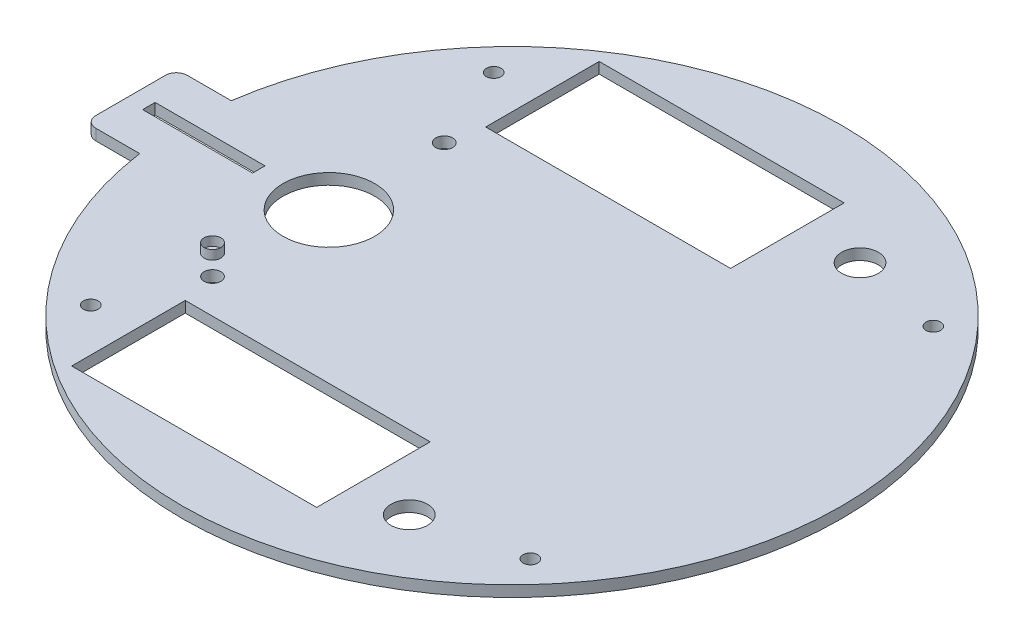
ISO-10303-21;
HEADER;
FILE_DESCRIPTION(('STEP AP214'),'2;1');
FILE_NAME('part.step','',(''),(''),'','','');
FILE_SCHEMA(('AUTOMOTIVE_DESIGN { 1 0 10303 214 1 1 1 1 }'));
ENDSEC;
DATA;
#1=APPLICATION_CONTEXT('core data for automotive mechanical design processes');
#2=APPLICATION_PROTOCOL_DEFINITION('international standard','automotive_design',2000,#1);
#3=PRODUCT_CONTEXT('',#1,'mechanical');
#4=PRODUCT('Part','Part','',(#3));
#5=PRODUCT_RELATED_PRODUCT_CATEGORY('part','',(#4));
#6=PRODUCT_DEFINITION_FORMATION('','',#4);
#7=PRODUCT_DEFINITION_CONTEXT('part definition',#1,'design');
#8=PRODUCT_DEFINITION('design','',#6,#7);
#9=PRODUCT_DEFINITION_SHAPE('','',#8);
#10=(LENGTH_UNIT() NAMED_UNIT(*) SI_UNIT(.MILLI.,.METRE.));
#11=(NAMED_UNIT(*) PLANE_ANGLE_UNIT() SI_UNIT($,.RADIAN.));
#12=(NAMED_UNIT(*) SI_UNIT($,.STERADIAN.) SOLID_ANGLE_UNIT());
#13=UNCERTAINTY_MEASURE_WITH_UNIT(LENGTH_MEASURE(1.E-05),#10,'distance_accuracy_value','');
#14=(GEOMETRIC_REPRESENTATION_CONTEXT(3) GLOBAL_UNCERTAINTY_ASSIGNED_CONTEXT((#13)) GLOBAL_UNIT_ASSIGNED_CONTEXT((#10,
#11,#12)) REPRESENTATION_CONTEXT('',''));
#15=CARTESIAN_POINT('',(0.,0.,0.));
#16=DIRECTION('',(0.,0.,1.));
#17=DIRECTION('',(1.,0.,0.));
#18=AXIS2_PLACEMENT_3D('',#15,#16,#17);
#19=CARTESIAN_POINT('',(-50.1374045342575,8.49999999999994,31.6246690788129));
#20=DIRECTION('',(0.,1.,0.));
#21=DIRECTION('',(-0.573576436351045,0.,-0.819152044288993));
#22=AXIS2_PLACEMENT_3D('',#19,#20,#21);
#23=CYLINDRICAL_SURFACE('',#22,2.3);
#24=CARTESIAN_POINT('',(-50.1374045342575,8.49999999999994,31.6246690788129));
#25=DIRECTION('',(0.,1.,0.));
#26=DIRECTION('',(-0.573576436351045,0.,-0.819152044288993));
#27=AXIS2_PLACEMENT_3D('',#24,#25,#26);
#28=CIRCLE('',#27,2.3);
#29=CARTESIAN_POINT('',(-51.456630337865,8.49999999999994,29.7406193769482));
#30=VERTEX_POINT('',#29);
#31=EDGE_CURVE('E49',#30,#30,#28,.T.);
#32=ORIENTED_EDGE('',*,*,#31,.T.);
#33=EDGE_LOOP('',(#32));
#34=FACE_BOUND('',#33,.T.);
#35=CARTESIAN_POINT('',(-50.1374045342575,10.9999999999999,31.6246690788129));
#36=DIRECTION('',(0.,1.,0.));
#37=DIRECTION('',(-0.573576436351045,0.,-0.819152044288993));
#38=AXIS2_PLACEMENT_3D('',#35,#36,#37);
#39=CIRCLE('',#38,2.3);
#40=CARTESIAN_POINT('',(-51.456630337865,10.9999999999999,29.7406193769482));
#41=VERTEX_POINT('',#40);
#42=EDGE_CURVE('E11',#41,#41,#39,.T.);
#43=ORIENTED_EDGE('',*,*,#42,.F.);
#44=EDGE_LOOP('',(#43));
#45=FACE_BOUND('',#44,.T.);
#46=ADVANCED_FACE('F45',(#34,#45),#23,.T.);
#47=OPEN_SHELL('',(#46));
#48=SHELL_BASED_SURFACE_MODEL('B2',(#47));
#49=CARTESIAN_POINT('',(0.,3.,0.));
#50=DIRECTION('',(0.,-1.,0.));
#51=DIRECTION('',(0.,0.,-1.));
#52=AXIS2_PLACEMENT_3D('',#49,#50,#51);
#53=CYLINDRICAL_SURFACE('',#52,90.);
#54=CARTESIAN_POINT('',(0.,3.,0.));
#55=DIRECTION('',(0.,1.,0.));
#56=DIRECTION('',(0.,0.,1.));
#57=AXIS2_PLACEMENT_3D('',#54,#55,#56);
#58=CIRCLE('',#57,90.);
#59=CARTESIAN_POINT('',(-89.1277173498794,3.,12.5));
#60=VERTEX_POINT('',#59);
#61=CARTESIAN_POINT('',(-89.1277173498794,3.,-12.5));
#62=VERTEX_POINT('',#61);
#63=EDGE_CURVE('E108',#60,#62,#58,.T.);
#64=ORIENTED_EDGE('',*,*,#63,.F.);
#65=DIRECTION('',(0.,1.,0.));
#66=VECTOR('',#65,1.);
#67=CARTESIAN_POINT('',(-89.1277173498794,-29.1547594742265,12.5));
#68=LINE('',#67,#66);
#69=CARTESIAN_POINT('',(-89.1277173498794,0.,12.5));
#70=VERTEX_POINT('',#69);
#71=EDGE_CURVE('E296',#70,#60,#68,.T.);
#72=ORIENTED_EDGE('',*,*,#71,.F.);
#73=CARTESIAN_POINT('',(0.,0.,0.));
#74=DIRECTION('',(0.,1.,0.));
#75=DIRECTION('',(0.,0.,1.));
#76=AXIS2_PLACEMENT_3D('',#73,#74,#75);
#77=CIRCLE('',#76,90.);
#78=CARTESIAN_POINT('',(-89.1277173498794,0.,-12.5));
#79=VERTEX_POINT('',#78);
#80=EDGE_CURVE('E143',#70,#79,#77,.T.);
#81=ORIENTED_EDGE('',*,*,#80,.T.);
#82=DIRECTION('',(0.,1.,0.));
#83=VECTOR('',#82,1.);
#84=CARTESIAN_POINT('',(-89.1277173498794,-29.1547594742265,-12.5));
#85=LINE('',#84,#83);
#86=EDGE_CURVE('E317',#79,#62,#85,.T.);
#87=ORIENTED_EDGE('',*,*,#86,.T.);
#88=EDGE_LOOP('',(#64,#72,#81,#87));
#89=FACE_BOUND('',#88,.T.);
#90=ADVANCED_FACE('F135',(#89),#53,.T.);
#91=CARTESIAN_POINT('',(0.,3.,0.));
#92=DIRECTION('',(0.,1.,0.));
#93=DIRECTION('',(0.,0.,1.));
#94=AXIS2_PLACEMENT_3D('',#91,#92,#93);
#95=PLANE('',#94);
#96=DIRECTION('',(0.,0.,-1.));
#97=VECTOR('',#96,1.);
#98=CARTESIAN_POINT('',(-69.1277173498794,3.,-1.69999999999997));
#99=LINE('',#98,#97);
#100=CARTESIAN_POINT('',(-69.1277173498794,3.,1.70000000000003));
#101=VERTEX_POINT('',#100);
#102=CARTESIAN_POINT('',(-69.1277173498794,3.,-1.69999999999997));
#103=VERTEX_POINT('',#102);
#104=EDGE_CURVE('E151',#101,#103,#99,.T.);
#105=ORIENTED_EDGE('',*,*,#104,.F.);
#106=DIRECTION('',(1.,0.,0.));
#107=VECTOR('',#106,1.);
#108=CARTESIAN_POINT('',(-99.1277173498794,3.,1.70000000000003));
#109=LINE('',#108,#107);
#110=CARTESIAN_POINT('',(-99.1277173498794,3.,1.70000000000003));
#111=VERTEX_POINT('',#110);
#112=EDGE_CURVE('E280',#111,#101,#109,.T.);
#113=ORIENTED_EDGE('',*,*,#112,.F.);
#114=DIRECTION('',(0.,0.,1.));
#115=VECTOR('',#114,1.);
#116=CARTESIAN_POINT('',(-99.1277173498794,3.,-1.69999999999997));
#117=LINE('',#116,#115);
#118=CARTESIAN_POINT('',(-99.1277173498794,3.,-1.69999999999997));
#119=VERTEX_POINT('',#118);
#120=EDGE_CURVE('E264',#119,#111,#117,.T.);
#121=ORIENTED_EDGE('',*,*,#120,.F.);
#122=DIRECTION('',(-1.,0.,0.));
#123=VECTOR('',#122,1.);
#124=CARTESIAN_POINT('',(-99.1277173498794,3.,-1.69999999999997));
#125=LINE('',#124,#123);
#126=EDGE_CURVE('E273',#103,#119,#125,.T.);
#127=ORIENTED_EDGE('',*,*,#126,.F.);
#128=EDGE_LOOP('',(#105,#113,#121,#127));
#129=FACE_BOUND('',#128,.T.);
#130=ORIENTED_EDGE('',*,*,#63,.T.);
#131=DIRECTION('',(-1.,0.,0.));
#132=VECTOR('',#131,1.);
#133=CARTESIAN_POINT('',(-89.1277173498794,3.,-12.5));
#134=LINE('',#133,#132);
#135=CARTESIAN_POINT('',(-101.127717349879,3.,-12.5));
#136=VERTEX_POINT('',#135);
#137=EDGE_CURVE('E291',#62,#136,#134,.T.);
#138=ORIENTED_EDGE('',*,*,#137,.T.);
#139=CARTESIAN_POINT('',(-101.127717349879,3.,-9.5));
#140=DIRECTION('',(0.,1.,0.));
#141=DIRECTION('',(0.,0.,1.));
#142=AXIS2_PLACEMENT_3D('',#139,#140,#141);
#143=CIRCLE('',#142,3.);
#144=CARTESIAN_POINT('',(-104.127717349879,3.,-9.49999999999998));
#145=VERTEX_POINT('',#144);
#146=EDGE_CURVE('E305',#136,#145,#143,.T.);
#147=ORIENTED_EDGE('',*,*,#146,.T.);
#148=DIRECTION('',(0.,0.,1.));
#149=VECTOR('',#148,1.);
#150=CARTESIAN_POINT('',(-104.127717349879,3.,-9.49999999999998));
#151=LINE('',#150,#149);
#152=CARTESIAN_POINT('',(-104.127717349879,3.,9.49999999999998));
#153=VERTEX_POINT('',#152);
#154=EDGE_CURVE('E308',#145,#153,#151,.T.);
#155=ORIENTED_EDGE('',*,*,#154,.T.);
#156=CARTESIAN_POINT('',(-101.127717349879,3.,9.5));
#157=DIRECTION('',(0.,1.,0.));
#158=DIRECTION('',(0.,0.,-1.));
#159=AXIS2_PLACEMENT_3D('',#156,#157,#158);
#160=CIRCLE('',#159,3.);
#161=CARTESIAN_POINT('',(-101.127717349879,3.,12.5));
#162=VERTEX_POINT('',#161);
#163=EDGE_CURVE('E311',#153,#162,#160,.T.);
#164=ORIENTED_EDGE('',*,*,#163,.T.);
#165=DIRECTION('',(1.,0.,0.));
#166=VECTOR('',#165,1.);
#167=CARTESIAN_POINT('',(-89.1277173498794,3.,12.5));
#168=LINE('',#167,#166);
#169=EDGE_CURVE('E314',#162,#60,#168,.T.);
#170=ORIENTED_EDGE('',*,*,#169,.T.);
#171=EDGE_LOOP('',(#130,#138,#147,#155,#164,#170));
#172=FACE_BOUND('',#171,.T.);
#173=CARTESIAN_POINT('',(-50.1374045342575,3.,31.6246690788129));
#174=DIRECTION('',(0.,1.,0.));
#175=DIRECTION('',(0.,0.,1.));
#176=AXIS2_PLACEMENT_3D('',#173,#174,#175);
#177=CIRCLE('',#176,2.3);
#178=CARTESIAN_POINT('',(-50.1374045342575,3.,33.9246690788129));
#179=VERTEX_POINT('',#178);
#180=EDGE_CURVE('E332',#179,#179,#177,.T.);
#181=ORIENTED_EDGE('',*,*,#180,.F.);
#182=EDGE_LOOP('',(#181));
#183=FACE_BOUND('',#182,.T.);
#184=CARTESIAN_POINT('',(-50.1374045342575,3.,-31.6246690788129));
#185=DIRECTION('',(0.,1.,0.));
#186=DIRECTION('',(0.,0.,-1.));
#187=AXIS2_PLACEMENT_3D('',#184,#185,#186);
#188=CIRCLE('',#187,2.3);
#189=CARTESIAN_POINT('',(-50.1374045342575,3.,-33.9246690788129));
#190=VERTEX_POINT('',#189);
#191=EDGE_CURVE('E331',#190,#190,#188,.T.);
#192=ORIENTED_EDGE('',*,*,#191,.F.);
#193=EDGE_LOOP('',(#192));
#194=FACE_BOUND('',#193,.T.);
#195=CARTESIAN_POINT('',(35.,3.,-60.));
#196=DIRECTION('',(0.,1.,0.));
#197=DIRECTION('',(0.,0.,1.));
#198=AXIS2_PLACEMENT_3D('',#195,#196,#197);
#199=CIRCLE('',#198,5.);
#200=CARTESIAN_POINT('',(35.,3.,-55.));
#201=VERTEX_POINT('',#200);
#202=EDGE_CURVE('E344',#201,#201,#199,.T.);
#203=ORIENTED_EDGE('',*,*,#202,.F.);
#204=EDGE_LOOP('',(#203));
#205=FACE_BOUND('',#204,.T.);
#206=CARTESIAN_POINT('',(33.0430680230137,3.,61.0995552817407));
#207=DIRECTION('',(0.,1.,0.));
#208=DIRECTION('',(0.,0.,-1.));
#209=AXIS2_PLACEMENT_3D('',#206,#207,#208);
#210=CIRCLE('',#209,4.99999999999998);
#211=CARTESIAN_POINT('',(33.0430680230137,3.,56.0995552817407));
#212=VERTEX_POINT('',#211);
#213=EDGE_CURVE('E339',#212,#212,#210,.T.);
#214=ORIENTED_EDGE('',*,*,#213,.F.);
#215=EDGE_LOOP('',(#214));
#216=FACE_BOUND('',#215,.T.);
#217=CARTESIAN_POINT('',(60.,3.,-55.));
#218=DIRECTION('',(0.,1.,0.));
#219=DIRECTION('',(0.,0.,1.));
#220=AXIS2_PLACEMENT_3D('',#217,#218,#219);
#221=CIRCLE('',#220,2.);
#222=CARTESIAN_POINT('',(60.,3.,-53.));
#223=VERTEX_POINT('',#222);
#224=EDGE_CURVE('E366',#223,#223,#221,.T.);
#225=ORIENTED_EDGE('',*,*,#224,.F.);
#226=EDGE_LOOP('',(#225));
#227=FACE_BOUND('',#226,.T.);
#228=CARTESIAN_POINT('',(60.,3.,55.));
#229=DIRECTION('',(0.,1.,0.));
#230=DIRECTION('',(0.,0.,1.));
#231=AXIS2_PLACEMENT_3D('',#228,#229,#230);
#232=CIRCLE('',#231,2.);
#233=CARTESIAN_POINT('',(60.,3.,57.));
#234=VERTEX_POINT('',#233);
#235=EDGE_CURVE('E360',#234,#234,#232,.T.);
#236=ORIENTED_EDGE('',*,*,#235,.F.);
#237=EDGE_LOOP('',(#236));
#238=FACE_BOUND('',#237,.T.);
#239=CARTESIAN_POINT('',(-60.,3.,55.));
#240=DIRECTION('',(0.,1.,0.));
#241=DIRECTION('',(0.,0.,1.));
#242=AXIS2_PLACEMENT_3D('',#239,#240,#241);
#243=CIRCLE('',#242,2.);
#244=CARTESIAN_POINT('',(-60.,3.,57.));
#245=VERTEX_POINT('',#244);
#246=EDGE_CURVE('E354',#245,#245,#243,.T.);
#247=ORIENTED_EDGE('',*,*,#246,.F.);
#248=EDGE_LOOP('',(#247));
#249=FACE_BOUND('',#248,.T.);
#250=CARTESIAN_POINT('',(-60.,3.,-55.));
#251=DIRECTION('',(0.,1.,0.));
#252=DIRECTION('',(0.,0.,1.));
#253=AXIS2_PLACEMENT_3D('',#250,#251,#252);
#254=CIRCLE('',#253,2.);
#255=CARTESIAN_POINT('',(-60.,3.,-53.));
#256=VERTEX_POINT('',#255);
#257=EDGE_CURVE('E353',#256,#256,#254,.T.);
#258=ORIENTED_EDGE('',*,*,#257,.F.);
#259=EDGE_LOOP('',(#258));
#260=FACE_BOUND('',#259,.T.);
#261=CARTESIAN_POINT('',(-50.,3.,0.));
#262=DIRECTION('',(0.,1.,0.));
#263=DIRECTION('',(0.,0.,1.));
#264=AXIS2_PLACEMENT_3D('',#261,#262,#263);
#265=CIRCLE('',#264,12.5);
#266=CARTESIAN_POINT('',(-50.,3.,12.5));
#267=VERTEX_POINT('',#266);
#268=EDGE_CURVE('E372',#267,#267,#265,.T.);
#269=ORIENTED_EDGE('',*,*,#268,.F.);
#270=EDGE_LOOP('',(#269));
#271=FACE_BOUND('',#270,.T.);
#272=DIRECTION('',(0.,0.,-1.));
#273=VECTOR('',#272,1.);
#274=CARTESIAN_POINT('',(18.6687234134701,3.,-72.0000000000001));
#275=LINE('',#274,#273);
#276=CARTESIAN_POINT('',(18.6687234134701,3.,-41.));
#277=VERTEX_POINT('',#276);
#278=CARTESIAN_POINT('',(18.6687234134701,3.,-72.0000000000001));
#279=VERTEX_POINT('',#278);
#280=EDGE_CURVE('E395',#277,#279,#275,.T.);
#281=ORIENTED_EDGE('',*,*,#280,.F.);
#282=DIRECTION('',(1.,0.,0.));
#283=VECTOR('',#282,1.);
#284=CARTESIAN_POINT('',(-48.1999877606628,3.,-41.));
#285=LINE('',#284,#283);
#286=CARTESIAN_POINT('',(-48.1999877606628,3.,-41.));
#287=VERTEX_POINT('',#286);
#288=EDGE_CURVE('E385',#287,#277,#285,.T.);
#289=ORIENTED_EDGE('',*,*,#288,.F.);
#290=DIRECTION('',(0.,0.,1.));
#291=VECTOR('',#290,1.);
#292=CARTESIAN_POINT('',(-48.1999877606628,3.,-72.0000000000001));
#293=LINE('',#292,#291);
#294=CARTESIAN_POINT('',(-48.1999877606628,3.,-72.0000000000001));
#295=VERTEX_POINT('',#294);
#296=EDGE_CURVE('E401',#295,#287,#293,.T.);
#297=ORIENTED_EDGE('',*,*,#296,.F.);
#298=DIRECTION('',(-1.,0.,0.));
#299=VECTOR('',#298,1.);
#300=CARTESIAN_POINT('',(-48.1999877606628,3.,-72.0000000000001));
#301=LINE('',#300,#299);
#302=EDGE_CURVE('E397',#279,#295,#301,.T.);
#303=ORIENTED_EDGE('',*,*,#302,.F.);
#304=EDGE_LOOP('',(#281,#289,#297,#303));
#305=FACE_BOUND('',#304,.T.);
#306=DIRECTION('',(0.,0.,-1.));
#307=VECTOR('',#306,1.);
#308=CARTESIAN_POINT('',(18.66872341347,3.,41.));
#309=LINE('',#308,#307);
#310=CARTESIAN_POINT('',(18.66872341347,3.,72.));
#311=VERTEX_POINT('',#310);
#312=CARTESIAN_POINT('',(18.66872341347,3.,41.));
#313=VERTEX_POINT('',#312);
#314=EDGE_CURVE('E378',#311,#313,#309,.T.);
#315=ORIENTED_EDGE('',*,*,#314,.F.);
#316=DIRECTION('',(1.,0.,0.));
#317=VECTOR('',#316,1.);
#318=CARTESIAN_POINT('',(-48.1999877606628,3.,72.));
#319=LINE('',#318,#317);
#320=CARTESIAN_POINT('',(-48.1999877606628,3.,72.));
#321=VERTEX_POINT('',#320);
#322=EDGE_CURVE('E418',#321,#311,#319,.T.);
#323=ORIENTED_EDGE('',*,*,#322,.F.);
#324=DIRECTION('',(0.,0.,1.));
#325=VECTOR('',#324,1.);
#326=CARTESIAN_POINT('',(-48.1999877606628,3.,41.));
#327=LINE('',#326,#325);
#328=CARTESIAN_POINT('',(-48.1999877606628,3.,41.));
#329=VERTEX_POINT('',#328);
#330=EDGE_CURVE('E432',#329,#321,#327,.T.);
#331=ORIENTED_EDGE('',*,*,#330,.F.);
#332=DIRECTION('',(-1.,0.,0.));
#333=VECTOR('',#332,1.);
#334=CARTESIAN_POINT('',(-48.1999877606628,3.,41.));
#335=LINE('',#334,#333);
#336=EDGE_CURVE('E429',#313,#329,#335,.T.);
#337=ORIENTED_EDGE('',*,*,#336,.F.);
#338=EDGE_LOOP('',(#315,#323,#331,#337));
#339=FACE_BOUND('',#338,.T.);
#340=ADVANCED_FACE('F277',(#129,#172,#183,#194,#205,#216,#227,#238,#249,#260,#271,#305,#339),
#95,.T.);
#341=CARTESIAN_POINT('',(0.,0.,0.));
#342=DIRECTION('',(0.,1.,0.));
#343=DIRECTION('',(0.,0.,1.));
#344=AXIS2_PLACEMENT_3D('',#341,#342,#343);
#345=PLANE('',#344);
#346=DIRECTION('',(-1.,0.,0.));
#347=VECTOR('',#346,1.);
#348=CARTESIAN_POINT('',(-99.1277173498794,0.,1.70000000000003));
#349=LINE('',#348,#347);
#350=CARTESIAN_POINT('',(-69.1277173498794,0.,1.70000000000003));
#351=VERTEX_POINT('',#350);
#352=CARTESIAN_POINT('',(-99.1277173498794,0.,1.70000000000003));
#353=VERTEX_POINT('',#352);
#354=EDGE_CURVE('E583',#351,#353,#349,.T.);
#355=ORIENTED_EDGE('',*,*,#354,.F.);
#356=DIRECTION('',(0.,0.,1.));
#357=VECTOR('',#356,1.);
#358=CARTESIAN_POINT('',(-69.1277173498794,0.,-1.69999999999997));
#359=LINE('',#358,#357);
#360=CARTESIAN_POINT('',(-69.1277173498794,0.,-1.69999999999997));
#361=VERTEX_POINT('',#360);
#362=EDGE_CURVE('E292',#361,#351,#359,.T.);
#363=ORIENTED_EDGE('',*,*,#362,.F.);
#364=DIRECTION('',(1.,0.,0.));
#365=VECTOR('',#364,1.);
#366=CARTESIAN_POINT('',(-99.1277173498794,0.,-1.69999999999997));
#367=LINE('',#366,#365);
#368=CARTESIAN_POINT('',(-99.1277173498794,0.,-1.69999999999997));
#369=VERTEX_POINT('',#368);
#370=EDGE_CURVE('E289',#369,#361,#367,.T.);
#371=ORIENTED_EDGE('',*,*,#370,.F.);
#372=DIRECTION('',(0.,0.,-1.));
#373=VECTOR('',#372,1.);
#374=CARTESIAN_POINT('',(-99.1277173498794,0.,-1.69999999999997));
#375=LINE('',#374,#373);
#376=EDGE_CURVE('E267',#353,#369,#375,.T.);
#377=ORIENTED_EDGE('',*,*,#376,.F.);
#378=EDGE_LOOP('',(#355,#363,#371,#377));
#379=FACE_BOUND('',#378,.T.);
#380=CARTESIAN_POINT('',(-50.1374045342575,0.,31.6246690788129));
#381=DIRECTION('',(0.,1.,0.));
#382=DIRECTION('',(0.,0.,1.));
#383=AXIS2_PLACEMENT_3D('',#380,#381,#382);
#384=CIRCLE('',#383,2.3);
#385=CARTESIAN_POINT('',(-50.1374045342575,0.,33.9246690788129));
#386=VERTEX_POINT('',#385);
#387=EDGE_CURVE('E335',#386,#386,#384,.F.);
#388=ORIENTED_EDGE('',*,*,#387,.F.);
#389=EDGE_LOOP('',(#388));
#390=FACE_BOUND('',#389,.T.);
#391=CARTESIAN_POINT('',(-50.1374045342575,0.,-31.6246690788129));
#392=DIRECTION('',(0.,1.,0.));
#393=DIRECTION('',(0.,0.,1.));
#394=AXIS2_PLACEMENT_3D('',#391,#392,#393);
#395=CIRCLE('',#394,2.3);
#396=CARTESIAN_POINT('',(-50.1374045342575,0.,-29.3246690788129));
#397=VERTEX_POINT('',#396);
#398=EDGE_CURVE('E336',#397,#397,#395,.F.);
#399=ORIENTED_EDGE('',*,*,#398,.F.);
#400=EDGE_LOOP('',(#399));
#401=FACE_BOUND('',#400,.T.);
#402=CARTESIAN_POINT('',(35.,0.,-60.));
#403=DIRECTION('',(0.,1.,0.));
#404=DIRECTION('',(0.,0.,1.));
#405=AXIS2_PLACEMENT_3D('',#402,#403,#404);
#406=CIRCLE('',#405,5.);
#407=CARTESIAN_POINT('',(35.,0.,-55.));
#408=VERTEX_POINT('',#407);
#409=EDGE_CURVE('E138',#408,#408,#406,.T.);
#410=ORIENTED_EDGE('',*,*,#409,.T.);
#411=EDGE_LOOP('',(#410));
#412=FACE_BOUND('',#411,.T.);
#413=CARTESIAN_POINT('',(33.0430680230137,0.,61.0995552817407));
#414=DIRECTION('',(0.,1.,0.));
#415=DIRECTION('',(0.,0.,1.));
#416=AXIS2_PLACEMENT_3D('',#413,#414,#415);
#417=CIRCLE('',#416,4.99999999999998);
#418=CARTESIAN_POINT('',(33.0430680230137,0.,66.0995552817407));
#419=VERTEX_POINT('',#418);
#420=EDGE_CURVE('E347',#419,#419,#417,.T.);
#421=ORIENTED_EDGE('',*,*,#420,.T.);
#422=EDGE_LOOP('',(#421));
#423=FACE_BOUND('',#422,.T.);
#424=CARTESIAN_POINT('',(60.,0.,-55.));
#425=DIRECTION('',(0.,1.,0.));
#426=DIRECTION('',(0.,0.,1.));
#427=AXIS2_PLACEMENT_3D('',#424,#425,#426);
#428=CIRCLE('',#427,2.);
#429=CARTESIAN_POINT('',(60.,0.,-53.));
#430=VERTEX_POINT('',#429);
#431=EDGE_CURVE('E363',#430,#430,#428,.T.);
#432=ORIENTED_EDGE('',*,*,#431,.T.);
#433=EDGE_LOOP('',(#432));
#434=FACE_BOUND('',#433,.T.);
#435=CARTESIAN_POINT('',(60.,0.,55.));
#436=DIRECTION('',(0.,1.,0.));
#437=DIRECTION('',(0.,0.,1.));
#438=AXIS2_PLACEMENT_3D('',#435,#436,#437);
#439=CIRCLE('',#438,2.);
#440=CARTESIAN_POINT('',(60.,0.,57.));
#441=VERTEX_POINT('',#440);
#442=EDGE_CURVE('E357',#441,#441,#439,.T.);
#443=ORIENTED_EDGE('',*,*,#442,.T.);
#444=EDGE_LOOP('',(#443));
#445=FACE_BOUND('',#444,.T.);
#446=CARTESIAN_POINT('',(-60.,0.,55.));
#447=DIRECTION('',(0.,1.,0.));
#448=DIRECTION('',(0.,0.,1.));
#449=AXIS2_PLACEMENT_3D('',#446,#447,#448);
#450=CIRCLE('',#449,2.);
#451=CARTESIAN_POINT('',(-60.,0.,57.));
#452=VERTEX_POINT('',#451);
#453=EDGE_CURVE('E350',#452,#452,#450,.T.);
#454=ORIENTED_EDGE('',*,*,#453,.T.);
#455=EDGE_LOOP('',(#454));
#456=FACE_BOUND('',#455,.T.);
#457=CARTESIAN_POINT('',(-60.,0.,-55.));
#458=DIRECTION('',(0.,1.,0.));
#459=DIRECTION('',(0.,0.,1.));
#460=AXIS2_PLACEMENT_3D('',#457,#458,#459);
#461=CIRCLE('',#460,2.);
#462=CARTESIAN_POINT('',(-60.,0.,-53.));
#463=VERTEX_POINT('',#462);
#464=EDGE_CURVE('E369',#463,#463,#461,.T.);
#465=ORIENTED_EDGE('',*,*,#464,.T.);
#466=EDGE_LOOP('',(#465));
#467=FACE_BOUND('',#466,.T.);
#468=CARTESIAN_POINT('',(-50.,0.,0.));
#469=DIRECTION('',(0.,1.,0.));
#470=DIRECTION('',(0.,0.,1.));
#471=AXIS2_PLACEMENT_3D('',#468,#469,#470);
#472=CIRCLE('',#471,12.5);
#473=CARTESIAN_POINT('',(-50.,0.,12.5));
#474=VERTEX_POINT('',#473);
#475=EDGE_CURVE('E375',#474,#474,#472,.T.);
#476=ORIENTED_EDGE('',*,*,#475,.T.);
#477=EDGE_LOOP('',(#476));
#478=FACE_BOUND('',#477,.T.);
#479=DIRECTION('',(1.,0.,0.));
#480=VECTOR('',#479,1.);
#481=CARTESIAN_POINT('',(-48.1999877606628,0.,-41.));
#482=LINE('',#481,#480);
#483=CARTESIAN_POINT('',(-48.1999877606628,0.,-41.));
#484=VERTEX_POINT('',#483);
#485=CARTESIAN_POINT('',(18.6687234134701,0.,-41.));
#486=VERTEX_POINT('',#485);
#487=EDGE_CURVE('E391',#484,#486,#482,.T.);
#488=ORIENTED_EDGE('',*,*,#487,.T.);
#489=DIRECTION('',(0.,0.,-1.));
#490=VECTOR('',#489,1.);
#491=CARTESIAN_POINT('',(18.6687234134701,0.,-72.0000000000001));
#492=LINE('',#491,#490);
#493=CARTESIAN_POINT('',(18.6687234134701,0.,-72.0000000000001));
#494=VERTEX_POINT('',#493);
#495=EDGE_CURVE('E381',#486,#494,#492,.T.);
#496=ORIENTED_EDGE('',*,*,#495,.T.);
#497=DIRECTION('',(-1.,0.,0.));
#498=VECTOR('',#497,1.);
#499=CARTESIAN_POINT('',(-48.1999877606628,0.,-72.0000000000001));
#500=LINE('',#499,#498);
#501=CARTESIAN_POINT('',(-48.1999877606628,0.,-72.0000000000001));
#502=VERTEX_POINT('',#501);
#503=EDGE_CURVE('E384',#494,#502,#500,.T.);
#504=ORIENTED_EDGE('',*,*,#503,.T.);
#505=DIRECTION('',(0.,0.,1.));
#506=VECTOR('',#505,1.);
#507=CARTESIAN_POINT('',(-48.1999877606628,0.,-72.0000000000001));
#508=LINE('',#507,#506);
#509=EDGE_CURVE('E388',#502,#484,#508,.T.);
#510=ORIENTED_EDGE('',*,*,#509,.T.);
#511=EDGE_LOOP('',(#488,#496,#504,#510));
#512=FACE_BOUND('',#511,.T.);
#513=DIRECTION('',(1.,0.,0.));
#514=VECTOR('',#513,1.);
#515=CARTESIAN_POINT('',(-48.1999877606628,0.,72.));
#516=LINE('',#515,#514);
#517=CARTESIAN_POINT('',(-48.1999877606628,0.,72.));
#518=VERTEX_POINT('',#517);
#519=CARTESIAN_POINT('',(18.66872341347,0.,72.));
#520=VERTEX_POINT('',#519);
#521=EDGE_CURVE('E424',#518,#520,#516,.T.);
#522=ORIENTED_EDGE('',*,*,#521,.T.);
#523=DIRECTION('',(0.,0.,-1.));
#524=VECTOR('',#523,1.);
#525=CARTESIAN_POINT('',(18.66872341347,0.,41.));
#526=LINE('',#525,#524);
#527=CARTESIAN_POINT('',(18.66872341347,0.,41.));
#528=VERTEX_POINT('',#527);
#529=EDGE_CURVE('E414',#520,#528,#526,.T.);
#530=ORIENTED_EDGE('',*,*,#529,.T.);
#531=DIRECTION('',(-1.,0.,0.));
#532=VECTOR('',#531,1.);
#533=CARTESIAN_POINT('',(-48.1999877606628,0.,41.));
#534=LINE('',#533,#532);
#535=CARTESIAN_POINT('',(-48.1999877606628,0.,41.));
#536=VERTEX_POINT('',#535);
#537=EDGE_CURVE('E417',#528,#536,#534,.T.);
#538=ORIENTED_EDGE('',*,*,#537,.T.);
#539=DIRECTION('',(0.,0.,1.));
#540=VECTOR('',#539,1.);
#541=CARTESIAN_POINT('',(-48.1999877606628,0.,41.));
#542=LINE('',#541,#540);
#543=EDGE_CURVE('E421',#536,#518,#542,.T.);
#544=ORIENTED_EDGE('',*,*,#543,.T.);
#545=EDGE_LOOP('',(#522,#530,#538,#544));
#546=FACE_BOUND('',#545,.T.);
#547=ORIENTED_EDGE('',*,*,#80,.F.);
#548=DIRECTION('',(-1.,0.,0.));
#549=VECTOR('',#548,1.);
#550=CARTESIAN_POINT('',(-89.1277173498794,0.,12.5));
#551=LINE('',#550,#549);
#552=CARTESIAN_POINT('',(-101.127717349879,0.,12.5));
#553=VERTEX_POINT('',#552);
#554=EDGE_CURVE('E300',#70,#553,#551,.T.);
#555=ORIENTED_EDGE('',*,*,#554,.T.);
#556=CARTESIAN_POINT('',(-101.127717349879,0.,9.5));
#557=DIRECTION('',(0.,1.,0.));
#558=DIRECTION('',(0.,0.,1.));
#559=AXIS2_PLACEMENT_3D('',#556,#557,#558);
#560=CIRCLE('',#559,3.);
#561=CARTESIAN_POINT('',(-104.127717349879,0.,9.49999999999998));
#562=VERTEX_POINT('',#561);
#563=EDGE_CURVE('E298',#553,#562,#560,.F.);
#564=ORIENTED_EDGE('',*,*,#563,.T.);
#565=DIRECTION('',(0.,0.,-1.));
#566=VECTOR('',#565,1.);
#567=CARTESIAN_POINT('',(-104.127717349879,0.,-9.49999999999998));
#568=LINE('',#567,#566);
#569=CARTESIAN_POINT('',(-104.127717349879,0.,-9.49999999999998));
#570=VERTEX_POINT('',#569);
#571=EDGE_CURVE('E295',#562,#570,#568,.T.);
#572=ORIENTED_EDGE('',*,*,#571,.T.);
#573=CARTESIAN_POINT('',(-101.127717349879,0.,-9.5));
#574=DIRECTION('',(0.,1.,0.));
#575=DIRECTION('',(0.,0.,1.));
#576=AXIS2_PLACEMENT_3D('',#573,#574,#575);
#577=CIRCLE('',#576,3.);
#578=CARTESIAN_POINT('',(-101.127717349879,0.,-12.5));
#579=VERTEX_POINT('',#578);
#580=EDGE_CURVE('E293',#570,#579,#577,.F.);
#581=ORIENTED_EDGE('',*,*,#580,.T.);
#582=DIRECTION('',(1.,0.,0.));
#583=VECTOR('',#582,1.);
#584=CARTESIAN_POINT('',(-89.1277173498794,0.,-12.5));
#585=LINE('',#584,#583);
#586=EDGE_CURVE('E302',#579,#79,#585,.T.);
#587=ORIENTED_EDGE('',*,*,#586,.T.);
#588=EDGE_LOOP('',(#547,#555,#564,#572,#581,#587));
#589=FACE_BOUND('',#588,.T.);
#590=ADVANCED_FACE('F450',(#379,#390,#401,#412,#423,#434,#445,#456,#467,#478,#512,#546,#589),
#345,.F.);
#591=CARTESIAN_POINT('',(18.66872341347,0.,41.));
#592=DIRECTION('',(1.,0.,0.));
#593=DIRECTION('',(0.,0.,-1.));
#594=AXIS2_PLACEMENT_3D('',#591,#592,#593);
#595=PLANE('',#594);
#596=ORIENTED_EDGE('',*,*,#314,.T.);
#597=DIRECTION('',(0.,1.,0.));
#598=VECTOR('',#597,1.);
#599=CARTESIAN_POINT('',(18.66872341347,0.,41.));
#600=LINE('',#599,#598);
#601=EDGE_CURVE('E427',#528,#313,#600,.T.);
#602=ORIENTED_EDGE('',*,*,#601,.F.);
#603=ORIENTED_EDGE('',*,*,#529,.F.);
#604=DIRECTION('',(0.,1.,0.));
#605=VECTOR('',#604,1.);
#606=CARTESIAN_POINT('',(18.66872341347,0.,72.));
#607=LINE('',#606,#605);
#608=EDGE_CURVE('E398',#520,#311,#607,.T.);
#609=ORIENTED_EDGE('',*,*,#608,.T.);
#610=EDGE_LOOP('',(#596,#602,#603,#609));
#611=FACE_BOUND('',#610,.T.);
#612=ADVANCED_FACE('F551',(#611),#595,.F.);
#613=CARTESIAN_POINT('',(-48.1999877606628,0.,72.));
#614=DIRECTION('',(0.,0.,1.));
#615=DIRECTION('',(1.,0.,0.));
#616=AXIS2_PLACEMENT_3D('',#613,#614,#615);
#617=PLANE('',#616);
#618=ORIENTED_EDGE('',*,*,#322,.T.);
#619=ORIENTED_EDGE('',*,*,#608,.F.);
#620=ORIENTED_EDGE('',*,*,#521,.F.);
#621=DIRECTION('',(0.,1.,0.));
#622=VECTOR('',#621,1.);
#623=CARTESIAN_POINT('',(-48.1999877606628,0.,72.));
#624=LINE('',#623,#622);
#625=EDGE_CURVE('E438',#518,#321,#624,.T.);
#626=ORIENTED_EDGE('',*,*,#625,.T.);
#627=EDGE_LOOP('',(#618,#619,#620,#626));
#628=FACE_BOUND('',#627,.T.);
#629=ADVANCED_FACE('F560',(#628),#617,.F.);
#630=CARTESIAN_POINT('',(-48.1999877606628,0.,41.));
#631=DIRECTION('',(-1.,0.,0.));
#632=DIRECTION('',(0.,0.,1.));
#633=AXIS2_PLACEMENT_3D('',#630,#631,#632);
#634=PLANE('',#633);
#635=ORIENTED_EDGE('',*,*,#330,.T.);
#636=ORIENTED_EDGE('',*,*,#625,.F.);
#637=ORIENTED_EDGE('',*,*,#543,.F.);
#638=DIRECTION('',(0.,1.,0.));
#639=VECTOR('',#638,1.);
#640=CARTESIAN_POINT('',(-48.1999877606628,0.,41.));
#641=LINE('',#640,#639);
#642=EDGE_CURVE('E440',#536,#329,#641,.T.);
#643=ORIENTED_EDGE('',*,*,#642,.T.);
#644=EDGE_LOOP('',(#635,#636,#637,#643));
#645=FACE_BOUND('',#644,.T.);
#646=ADVANCED_FACE('F562',(#645),#634,.F.);
#647=CARTESIAN_POINT('',(-48.1999877606628,0.,41.));
#648=DIRECTION('',(0.,0.,-1.));
#649=DIRECTION('',(-1.,0.,0.));
#650=AXIS2_PLACEMENT_3D('',#647,#648,#649);
#651=PLANE('',#650);
#652=ORIENTED_EDGE('',*,*,#336,.T.);
#653=ORIENTED_EDGE('',*,*,#642,.F.);
#654=ORIENTED_EDGE('',*,*,#537,.F.);
#655=ORIENTED_EDGE('',*,*,#601,.T.);
#656=EDGE_LOOP('',(#652,#653,#654,#655));
#657=FACE_BOUND('',#656,.T.);
#658=ADVANCED_FACE('F555',(#657),#651,.F.);
#659=CARTESIAN_POINT('',(18.6687234134701,0.,-72.0000000000001));
#660=DIRECTION('',(1.,0.,0.));
#661=DIRECTION('',(0.,0.,-1.));
#662=AXIS2_PLACEMENT_3D('',#659,#660,#661);
#663=PLANE('',#662);
#664=ORIENTED_EDGE('',*,*,#280,.T.);
#665=DIRECTION('',(0.,1.,0.));
#666=VECTOR('',#665,1.);
#667=CARTESIAN_POINT('',(18.6687234134701,0.,-72.0000000000001));
#668=LINE('',#667,#666);
#669=EDGE_CURVE('E394',#494,#279,#668,.T.);
#670=ORIENTED_EDGE('',*,*,#669,.F.);
#671=ORIENTED_EDGE('',*,*,#495,.F.);
#672=DIRECTION('',(0.,1.,0.));
#673=VECTOR('',#672,1.);
#674=CARTESIAN_POINT('',(18.6687234134701,0.,-41.));
#675=LINE('',#674,#673);
#676=EDGE_CURVE('E406',#486,#277,#675,.T.);
#677=ORIENTED_EDGE('',*,*,#676,.T.);
#678=EDGE_LOOP('',(#664,#670,#671,#677));
#679=FACE_BOUND('',#678,.T.);
#680=ADVANCED_FACE('F569',(#679),#663,.F.);
#681=CARTESIAN_POINT('',(-48.1999877606628,0.,-41.));
#682=DIRECTION('',(0.,0.,1.));
#683=DIRECTION('',(1.,0.,0.));
#684=AXIS2_PLACEMENT_3D('',#681,#682,#683);
#685=PLANE('',#684);
#686=ORIENTED_EDGE('',*,*,#288,.T.);
#687=ORIENTED_EDGE('',*,*,#676,.F.);
#688=ORIENTED_EDGE('',*,*,#487,.F.);
#689=DIRECTION('',(0.,1.,0.));
#690=VECTOR('',#689,1.);
#691=CARTESIAN_POINT('',(-48.1999877606628,0.,-41.));
#692=LINE('',#691,#690);
#693=EDGE_CURVE('E408',#484,#287,#692,.T.);
#694=ORIENTED_EDGE('',*,*,#693,.T.);
#695=EDGE_LOOP('',(#686,#687,#688,#694));
#696=FACE_BOUND('',#695,.T.);
#697=ADVANCED_FACE('F673',(#696),#685,.F.);
#698=CARTESIAN_POINT('',(-48.1999877606628,0.,-72.0000000000001));
#699=DIRECTION('',(-1.,0.,0.));
#700=DIRECTION('',(0.,0.,1.));
#701=AXIS2_PLACEMENT_3D('',#698,#699,#700);
#702=PLANE('',#701);
#703=ORIENTED_EDGE('',*,*,#296,.T.);
#704=ORIENTED_EDGE('',*,*,#693,.F.);
#705=ORIENTED_EDGE('',*,*,#509,.F.);
#706=DIRECTION('',(0.,1.,0.));
#707=VECTOR('',#706,1.);
#708=CARTESIAN_POINT('',(-48.1999877606628,0.,-72.0000000000001));
#709=LINE('',#708,#707);
#710=EDGE_CURVE('E410',#502,#295,#709,.T.);
#711=ORIENTED_EDGE('',*,*,#710,.T.);
#712=EDGE_LOOP('',(#703,#704,#705,#711));
#713=FACE_BOUND('',#712,.T.);
#714=ADVANCED_FACE('F681',(#713),#702,.F.);
#715=CARTESIAN_POINT('',(-48.1999877606628,0.,-72.0000000000001));
#716=DIRECTION('',(0.,0.,-1.));
#717=DIRECTION('',(-1.,0.,0.));
#718=AXIS2_PLACEMENT_3D('',#715,#716,#717);
#719=PLANE('',#718);
#720=ORIENTED_EDGE('',*,*,#302,.T.);
#721=ORIENTED_EDGE('',*,*,#710,.F.);
#722=ORIENTED_EDGE('',*,*,#503,.F.);
#723=ORIENTED_EDGE('',*,*,#669,.T.);
#724=EDGE_LOOP('',(#720,#721,#722,#723));
#725=FACE_BOUND('',#724,.T.);
#726=ADVANCED_FACE('F690',(#725),#719,.F.);
#727=CARTESIAN_POINT('',(-50.,0.,0.));
#728=DIRECTION('',(0.,1.,0.));
#729=DIRECTION('',(0.,0.,1.));
#730=AXIS2_PLACEMENT_3D('',#727,#728,#729);
#731=CYLINDRICAL_SURFACE('',#730,12.5);
#732=ORIENTED_EDGE('',*,*,#475,.F.);
#733=EDGE_LOOP('',(#732));
#734=FACE_BOUND('',#733,.T.);
#735=ORIENTED_EDGE('',*,*,#268,.T.);
#736=EDGE_LOOP('',(#735));
#737=FACE_BOUND('',#736,.T.);
#738=ADVANCED_FACE('F699',(#734,#737),#731,.F.);
#739=CARTESIAN_POINT('',(-60.,0.,-55.));
#740=DIRECTION('',(0.,1.,0.));
#741=DIRECTION('',(0.,0.,1.));
#742=AXIS2_PLACEMENT_3D('',#739,#740,#741);
#743=CYLINDRICAL_SURFACE('',#742,2.);
#744=ORIENTED_EDGE('',*,*,#464,.F.);
#745=EDGE_LOOP('',(#744));
#746=FACE_BOUND('',#745,.T.);
#747=ORIENTED_EDGE('',*,*,#257,.T.);
#748=EDGE_LOOP('',(#747));
#749=FACE_BOUND('',#748,.T.);
#750=ADVANCED_FACE('F708',(#746,#749),#743,.F.);
#751=CARTESIAN_POINT('',(-60.,0.,55.));
#752=DIRECTION('',(0.,1.,0.));
#753=DIRECTION('',(0.,0.,1.));
#754=AXIS2_PLACEMENT_3D('',#751,#752,#753);
#755=CYLINDRICAL_SURFACE('',#754,2.);
#756=ORIENTED_EDGE('',*,*,#453,.F.);
#757=EDGE_LOOP('',(#756));
#758=FACE_BOUND('',#757,.T.);
#759=ORIENTED_EDGE('',*,*,#246,.T.);
#760=EDGE_LOOP('',(#759));
#761=FACE_BOUND('',#760,.T.);
#762=ADVANCED_FACE('F717',(#758,#761),#755,.F.);
#763=CARTESIAN_POINT('',(60.,0.,55.));
#764=DIRECTION('',(0.,1.,0.));
#765=DIRECTION('',(0.,0.,1.));
#766=AXIS2_PLACEMENT_3D('',#763,#764,#765);
#767=CYLINDRICAL_SURFACE('',#766,2.);
#768=ORIENTED_EDGE('',*,*,#442,.F.);
#769=EDGE_LOOP('',(#768));
#770=FACE_BOUND('',#769,.T.);
#771=ORIENTED_EDGE('',*,*,#235,.T.);
#772=EDGE_LOOP('',(#771));
#773=FACE_BOUND('',#772,.T.);
#774=ADVANCED_FACE('F726',(#770,#773),#767,.F.);
#775=CARTESIAN_POINT('',(60.,0.,-55.));
#776=DIRECTION('',(0.,1.,0.));
#777=DIRECTION('',(0.,0.,1.));
#778=AXIS2_PLACEMENT_3D('',#775,#776,#777);
#779=CYLINDRICAL_SURFACE('',#778,2.);
#780=ORIENTED_EDGE('',*,*,#431,.F.);
#781=EDGE_LOOP('',(#780));
#782=FACE_BOUND('',#781,.T.);
#783=ORIENTED_EDGE('',*,*,#224,.T.);
#784=EDGE_LOOP('',(#783));
#785=FACE_BOUND('',#784,.T.);
#786=ADVANCED_FACE('F465',(#782,#785),#779,.F.);
#787=CARTESIAN_POINT('',(33.0430680230137,-7.,61.0995552817407));
#788=DIRECTION('',(0.,1.,0.));
#789=DIRECTION('',(0.,0.,1.));
#790=AXIS2_PLACEMENT_3D('',#787,#788,#789);
#791=CYLINDRICAL_SURFACE('',#790,4.99999999999998);
#792=ORIENTED_EDGE('',*,*,#213,.T.);
#793=EDGE_LOOP('',(#792));
#794=FACE_BOUND('',#793,.T.);
#795=ORIENTED_EDGE('',*,*,#420,.F.);
#796=EDGE_LOOP('',(#795));
#797=FACE_BOUND('',#796,.T.);
#798=ADVANCED_FACE('F455',(#794,#797),#791,.F.);
#799=CARTESIAN_POINT('',(35.,-7.,-60.));
#800=DIRECTION('',(0.,1.,0.));
#801=DIRECTION('',(0.,0.,1.));
#802=AXIS2_PLACEMENT_3D('',#799,#800,#801);
#803=CYLINDRICAL_SURFACE('',#802,5.);
#804=ORIENTED_EDGE('',*,*,#202,.T.);
#805=EDGE_LOOP('',(#804));
#806=FACE_BOUND('',#805,.T.);
#807=ORIENTED_EDGE('',*,*,#409,.F.);
#808=EDGE_LOOP('',(#807));
#809=FACE_BOUND('',#808,.T.);
#810=ADVANCED_FACE('F452',(#806,#809),#803,.F.);
#811=CARTESIAN_POINT('',(-50.1374045342575,-6.50538238691623,-31.6246690788129));
#812=DIRECTION('',(0.,1.,0.));
#813=DIRECTION('',(0.,0.,1.));
#814=AXIS2_PLACEMENT_3D('',#811,#812,#813);
#815=CYLINDRICAL_SURFACE('',#814,2.3);
#816=ORIENTED_EDGE('',*,*,#398,.T.);
#817=EDGE_LOOP('',(#816));
#818=FACE_BOUND('',#817,.T.);
#819=ORIENTED_EDGE('',*,*,#191,.T.);
#820=EDGE_LOOP('',(#819));
#821=FACE_BOUND('',#820,.T.);
#822=ADVANCED_FACE('F454',(#818,#821),#815,.F.);
#823=CARTESIAN_POINT('',(-50.1374045342575,-6.50538238691623,31.6246690788129));
#824=DIRECTION('',(0.,1.,0.));
#825=DIRECTION('',(0.,0.,1.));
#826=AXIS2_PLACEMENT_3D('',#823,#824,#825);
#827=CYLINDRICAL_SURFACE('',#826,2.3);
#828=ORIENTED_EDGE('',*,*,#387,.T.);
#829=EDGE_LOOP('',(#828));
#830=FACE_BOUND('',#829,.T.);
#831=ORIENTED_EDGE('',*,*,#180,.T.);
#832=EDGE_LOOP('',(#831));
#833=FACE_BOUND('',#832,.T.);
#834=ADVANCED_FACE('F462',(#830,#833),#827,.F.);
#835=CARTESIAN_POINT('',(-89.1277173498794,-29.1547594742265,12.5));
#836=DIRECTION('',(0.,0.,1.));
#837=DIRECTION('',(1.,0.,0.));
#838=AXIS2_PLACEMENT_3D('',#835,#836,#837);
#839=PLANE('',#838);
#840=ORIENTED_EDGE('',*,*,#554,.F.);
#841=ORIENTED_EDGE('',*,*,#71,.T.);
#842=ORIENTED_EDGE('',*,*,#169,.F.);
#843=DIRECTION('',(0.,1.,0.));
#844=VECTOR('',#843,1.);
#845=CARTESIAN_POINT('',(-101.127717349879,-29.1547594742265,12.5));
#846=LINE('',#845,#844);
#847=EDGE_CURVE('E320',#553,#162,#846,.T.);
#848=ORIENTED_EDGE('',*,*,#847,.F.);
#849=EDGE_LOOP('',(#840,#841,#842,#848));
#850=FACE_BOUND('',#849,.T.);
#851=ADVANCED_FACE('F482',(#850),#839,.T.);
#852=CARTESIAN_POINT('',(-101.127717349879,-29.1547594742265,9.5));
#853=DIRECTION('',(0.,1.,0.));
#854=DIRECTION('',(0.,0.,1.));
#855=AXIS2_PLACEMENT_3D('',#852,#853,#854);
#856=CYLINDRICAL_SURFACE('',#855,3.);
#857=ORIENTED_EDGE('',*,*,#563,.F.);
#858=ORIENTED_EDGE('',*,*,#847,.T.);
#859=ORIENTED_EDGE('',*,*,#163,.F.);
#860=DIRECTION('',(0.,1.,0.));
#861=VECTOR('',#860,1.);
#862=CARTESIAN_POINT('',(-104.127717349879,-29.1547594742265,9.49999999999998));
#863=LINE('',#862,#861);
#864=EDGE_CURVE('E322',#562,#153,#863,.T.);
#865=ORIENTED_EDGE('',*,*,#864,.F.);
#866=EDGE_LOOP('',(#857,#858,#859,#865));
#867=FACE_BOUND('',#866,.T.);
#868=ADVANCED_FACE('F490',(#867),#856,.T.);
#869=CARTESIAN_POINT('',(-104.127717349879,-29.1547594742265,-9.49999999999998));
#870=DIRECTION('',(-1.,0.,0.));
#871=DIRECTION('',(0.,0.,1.));
#872=AXIS2_PLACEMENT_3D('',#869,#870,#871);
#873=PLANE('',#872);
#874=ORIENTED_EDGE('',*,*,#571,.F.);
#875=ORIENTED_EDGE('',*,*,#864,.T.);
#876=ORIENTED_EDGE('',*,*,#154,.F.);
#877=DIRECTION('',(0.,1.,0.));
#878=VECTOR('',#877,1.);
#879=CARTESIAN_POINT('',(-104.127717349879,-29.1547594742265,-9.49999999999998));
#880=LINE('',#879,#878);
#881=EDGE_CURVE('E324',#570,#145,#880,.T.);
#882=ORIENTED_EDGE('',*,*,#881,.F.);
#883=EDGE_LOOP('',(#874,#875,#876,#882));
#884=FACE_BOUND('',#883,.T.);
#885=ADVANCED_FACE('F496',(#884),#873,.T.);
#886=CARTESIAN_POINT('',(-101.127717349879,-29.1547594742265,-9.5));
#887=DIRECTION('',(0.,1.,0.));
#888=DIRECTION('',(0.,0.,1.));
#889=AXIS2_PLACEMENT_3D('',#886,#887,#888);
#890=CYLINDRICAL_SURFACE('',#889,3.);
#891=ORIENTED_EDGE('',*,*,#580,.F.);
#892=ORIENTED_EDGE('',*,*,#881,.T.);
#893=ORIENTED_EDGE('',*,*,#146,.F.);
#894=DIRECTION('',(0.,1.,0.));
#895=VECTOR('',#894,1.);
#896=CARTESIAN_POINT('',(-101.127717349879,-29.1547594742265,-12.5));
#897=LINE('',#896,#895);
#898=EDGE_CURVE('E326',#579,#136,#897,.T.);
#899=ORIENTED_EDGE('',*,*,#898,.F.);
#900=EDGE_LOOP('',(#891,#892,#893,#899));
#901=FACE_BOUND('',#900,.T.);
#902=ADVANCED_FACE('F499',(#901),#890,.T.);
#903=CARTESIAN_POINT('',(-89.1277173498794,-29.1547594742265,-12.5));
#904=DIRECTION('',(0.,0.,-1.));
#905=DIRECTION('',(-1.,0.,0.));
#906=AXIS2_PLACEMENT_3D('',#903,#904,#905);
#907=PLANE('',#906);
#908=ORIENTED_EDGE('',*,*,#586,.F.);
#909=ORIENTED_EDGE('',*,*,#898,.T.);
#910=ORIENTED_EDGE('',*,*,#137,.F.);
#911=ORIENTED_EDGE('',*,*,#86,.F.);
#912=EDGE_LOOP('',(#908,#909,#910,#911));
#913=FACE_BOUND('',#912,.T.);
#914=ADVANCED_FACE('F503',(#913),#907,.T.);
#915=CARTESIAN_POINT('',(-69.1277173498794,-30.1920519342426,-1.69999999999997));
#916=DIRECTION('',(1.,0.,0.));
#917=DIRECTION('',(0.,0.,-1.));
#918=AXIS2_PLACEMENT_3D('',#915,#916,#917);
#919=PLANE('',#918);
#920=ORIENTED_EDGE('',*,*,#362,.T.);
#921=DIRECTION('',(0.,1.,0.));
#922=VECTOR('',#921,1.);
#923=CARTESIAN_POINT('',(-69.1277173498794,-30.1920519342426,1.70000000000003));
#924=LINE('',#923,#922);
#925=EDGE_CURVE('E285',#351,#101,#924,.T.);
#926=ORIENTED_EDGE('',*,*,#925,.T.);
#927=ORIENTED_EDGE('',*,*,#104,.T.);
#928=DIRECTION('',(0.,1.,0.));
#929=VECTOR('',#928,1.);
#930=CARTESIAN_POINT('',(-69.1277173498794,-30.1920519342426,-1.69999999999997));
#931=LINE('',#930,#929);
#932=EDGE_CURVE('E270',#361,#103,#931,.T.);
#933=ORIENTED_EDGE('',*,*,#932,.F.);
#934=EDGE_LOOP('',(#920,#926,#927,#933));
#935=FACE_BOUND('',#934,.T.);
#936=ADVANCED_FACE('F505',(#935),#919,.F.);
#937=CARTESIAN_POINT('',(-99.1277173498794,-30.1920519342426,1.70000000000003));
#938=DIRECTION('',(0.,0.,1.));
#939=DIRECTION('',(1.,0.,0.));
#940=AXIS2_PLACEMENT_3D('',#937,#938,#939);
#941=PLANE('',#940);
#942=ORIENTED_EDGE('',*,*,#354,.T.);
#943=DIRECTION('',(0.,1.,0.));
#944=VECTOR('',#943,1.);
#945=CARTESIAN_POINT('',(-99.1277173498794,-30.1920519342426,1.70000000000003));
#946=LINE('',#945,#944);
#947=EDGE_CURVE('E269',#353,#111,#946,.T.);
#948=ORIENTED_EDGE('',*,*,#947,.T.);
#949=ORIENTED_EDGE('',*,*,#112,.T.);
#950=ORIENTED_EDGE('',*,*,#925,.F.);
#951=EDGE_LOOP('',(#942,#948,#949,#950));
#952=FACE_BOUND('',#951,.T.);
#953=ADVANCED_FACE('F511',(#952),#941,.F.);
#954=CARTESIAN_POINT('',(-99.1277173498794,-30.1920519342426,-1.69999999999997));
#955=DIRECTION('',(-1.,0.,0.));
#956=DIRECTION('',(0.,0.,1.));
#957=AXIS2_PLACEMENT_3D('',#954,#955,#956);
#958=PLANE('',#957);
#959=ORIENTED_EDGE('',*,*,#376,.T.);
#960=DIRECTION('',(0.,1.,0.));
#961=VECTOR('',#960,1.);
#962=CARTESIAN_POINT('',(-99.1277173498794,-30.1920519342426,-1.69999999999997));
#963=LINE('',#962,#961);
#964=EDGE_CURVE('E159',#369,#119,#963,.T.);
#965=ORIENTED_EDGE('',*,*,#964,.T.);
#966=ORIENTED_EDGE('',*,*,#120,.T.);
#967=ORIENTED_EDGE('',*,*,#947,.F.);
#968=EDGE_LOOP('',(#959,#965,#966,#967));
#969=FACE_BOUND('',#968,.T.);
#970=ADVANCED_FACE('F261',(#969),#958,.F.);
#971=CARTESIAN_POINT('',(-99.1277173498794,-30.1920519342426,-1.69999999999997));
#972=DIRECTION('',(0.,0.,-1.));
#973=DIRECTION('',(-1.,0.,0.));
#974=AXIS2_PLACEMENT_3D('',#971,#972,#973);
#975=PLANE('',#974);
#976=ORIENTED_EDGE('',*,*,#370,.T.);
#977=ORIENTED_EDGE('',*,*,#932,.T.);
#978=ORIENTED_EDGE('',*,*,#126,.T.);
#979=ORIENTED_EDGE('',*,*,#964,.F.);
#980=EDGE_LOOP('',(#976,#977,#978,#979));
#981=FACE_BOUND('',#980,.T.);
#982=ADVANCED_FACE('F274',(#981),#975,.F.);
#983=CLOSED_SHELL('',(#90,#340,#590,#612,#629,#646,#658,#680,#697,#714,#726,#738,#750,#762,#774,
#786,#798,#810,#822,#834,#851,#868,#885,#902,#914,#936,#953,#970,#982));
#984=MANIFOLD_SOLID_BREP('B71',#983);
#985=ADVANCED_BREP_SHAPE_REPRESENTATION('',(#18,#984),#14);
#986=MANIFOLD_SURFACE_SHAPE_REPRESENTATION('',(#18,#48),#14);
#987=SHAPE_REPRESENTATION('',(#18),#14);
#988=SHAPE_DEFINITION_REPRESENTATION(#9,#987);
#989=SHAPE_REPRESENTATION_RELATIONSHIP('','',#987,#985);
#990=SHAPE_REPRESENTATION_RELATIONSHIP('','',#987,#986);
ENDSEC;
END-ISO-10303-21;
